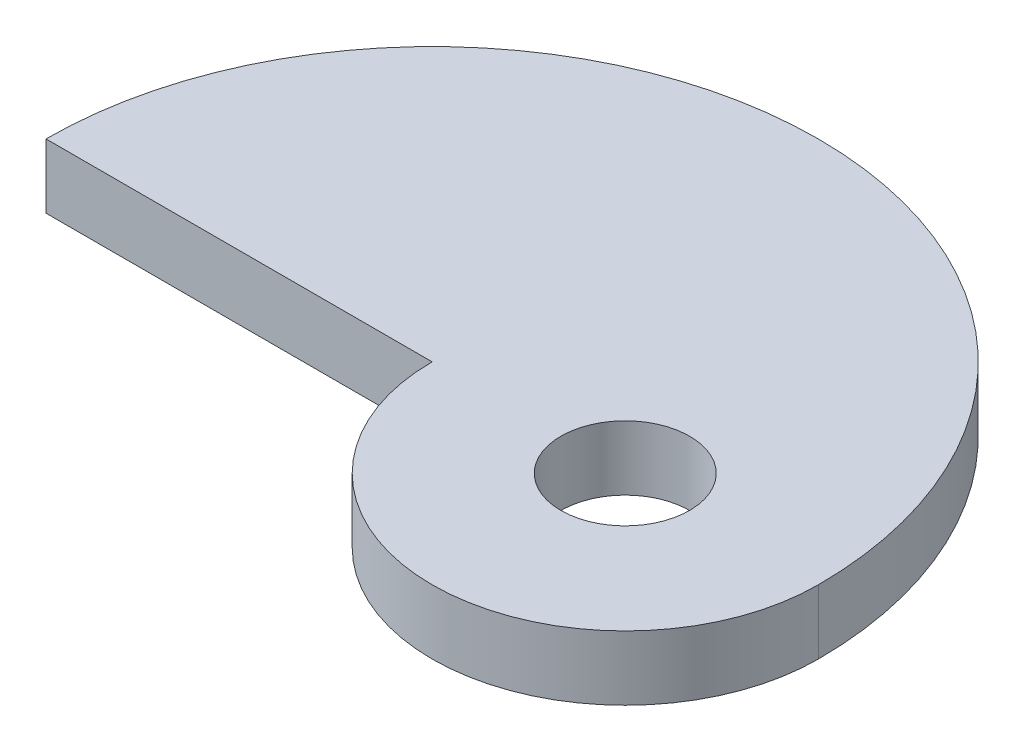
ISO-10303-21;
HEADER;
FILE_DESCRIPTION(('STEP AP214'),'2;1');
FILE_NAME('part.step','',(''),(''),'','','');
FILE_SCHEMA(('AUTOMOTIVE_DESIGN { 1 0 10303 214 1 1 1 1 }'));
ENDSEC;
DATA;
#1=APPLICATION_CONTEXT('core data for automotive mechanical design processes');
#2=APPLICATION_PROTOCOL_DEFINITION('international standard','automotive_design',2000,#1);
#3=PRODUCT_CONTEXT('',#1,'mechanical');
#4=PRODUCT('Part','Part','',(#3));
#5=PRODUCT_RELATED_PRODUCT_CATEGORY('part','',(#4));
#6=PRODUCT_DEFINITION_FORMATION('','',#4);
#7=PRODUCT_DEFINITION_CONTEXT('part definition',#1,'design');
#8=PRODUCT_DEFINITION('design','',#6,#7);
#9=PRODUCT_DEFINITION_SHAPE('','',#8);
#10=(LENGTH_UNIT() NAMED_UNIT(*) SI_UNIT(.MILLI.,.METRE.));
#11=(NAMED_UNIT(*) PLANE_ANGLE_UNIT() SI_UNIT($,.RADIAN.));
#12=(NAMED_UNIT(*) SI_UNIT($,.STERADIAN.) SOLID_ANGLE_UNIT());
#13=UNCERTAINTY_MEASURE_WITH_UNIT(LENGTH_MEASURE(1.E-05),#10,'distance_accuracy_value','');
#14=(GEOMETRIC_REPRESENTATION_CONTEXT(3) GLOBAL_UNCERTAINTY_ASSIGNED_CONTEXT((#13)) GLOBAL_UNIT_ASSIGNED_CONTEXT((#10,
#11,#12)) REPRESENTATION_CONTEXT('',''));
#15=CARTESIAN_POINT('',(0.,0.,0.));
#16=DIRECTION('',(0.,0.,1.));
#17=DIRECTION('',(1.,0.,0.));
#18=AXIS2_PLACEMENT_3D('',#15,#16,#17);
#19=CARTESIAN_POINT('',(0.,6.35,0.));
#20=DIRECTION('',(0.,0.,1.));
#21=DIRECTION('',(1.,0.,0.));
#22=AXIS2_PLACEMENT_3D('',#19,#20,#21);
#23=PLANE('',#22);
#24=DIRECTION('',(-1.,0.,0.));
#25=VECTOR('',#24,1.);
#26=CARTESIAN_POINT('',(0.,0.,0.));
#27=LINE('',#26,#25);
#28=CARTESIAN_POINT('',(0.,0.,0.));
#29=VERTEX_POINT('',#28);
#30=CARTESIAN_POINT('',(-38.1,0.,0.));
#31=VERTEX_POINT('',#30);
#32=EDGE_CURVE('E82',#29,#31,#27,.T.);
#33=ORIENTED_EDGE('',*,*,#32,.F.);
#34=DIRECTION('',(0.,-1.,0.));
#35=VECTOR('',#34,1.);
#36=CARTESIAN_POINT('',(0.,6.35,0.));
#37=LINE('',#36,#35);
#38=CARTESIAN_POINT('',(0.,6.35,0.));
#39=VERTEX_POINT('',#38);
#40=EDGE_CURVE('E11',#39,#29,#37,.T.);
#41=ORIENTED_EDGE('',*,*,#40,.F.);
#42=DIRECTION('',(-1.,0.,0.));
#43=VECTOR('',#42,1.);
#44=CARTESIAN_POINT('',(0.,6.35,0.));
#45=LINE('',#44,#43);
#46=CARTESIAN_POINT('',(-38.1,6.35,0.));
#47=VERTEX_POINT('',#46);
#48=EDGE_CURVE('E80',#39,#47,#45,.T.);
#49=ORIENTED_EDGE('',*,*,#48,.T.);
#50=DIRECTION('',(0.,-1.,0.));
#51=VECTOR('',#50,1.);
#52=CARTESIAN_POINT('',(-38.1,6.35,0.));
#53=LINE('',#52,#51);
#54=EDGE_CURVE('E76',#47,#31,#53,.T.);
#55=ORIENTED_EDGE('',*,*,#54,.T.);
#56=EDGE_LOOP('',(#33,#41,#49,#55));
#57=FACE_BOUND('',#56,.T.);
#58=ADVANCED_FACE('F41',(#57),#23,.T.);
#59=CARTESIAN_POINT('',(19.05,6.35,0.));
#60=DIRECTION('',(0.,-1.,0.));
#61=DIRECTION('',(0.,0.,-1.));
#62=AXIS2_PLACEMENT_3D('',#59,#60,#61);
#63=CYLINDRICAL_SURFACE('',#62,19.05);
#64=CARTESIAN_POINT('',(19.05,0.,0.));
#65=DIRECTION('',(0.,1.,0.));
#66=DIRECTION('',(0.,0.,1.));
#67=AXIS2_PLACEMENT_3D('',#64,#65,#66);
#68=CIRCLE('',#67,19.05);
#69=CARTESIAN_POINT('',(38.1,0.,0.));
#70=VERTEX_POINT('',#69);
#71=EDGE_CURVE('E70',#29,#70,#68,.T.);
#72=ORIENTED_EDGE('',*,*,#71,.T.);
#73=DIRECTION('',(0.,-1.,0.));
#74=VECTOR('',#73,1.);
#75=CARTESIAN_POINT('',(38.1,6.35,0.));
#76=LINE('',#75,#74);
#77=CARTESIAN_POINT('',(38.1,6.35,0.));
#78=VERTEX_POINT('',#77);
#79=EDGE_CURVE('E50',#78,#70,#76,.T.);
#80=ORIENTED_EDGE('',*,*,#79,.F.);
#81=CARTESIAN_POINT('',(19.05,6.35,0.));
#82=DIRECTION('',(0.,1.,0.));
#83=DIRECTION('',(0.,0.,1.));
#84=AXIS2_PLACEMENT_3D('',#81,#82,#83);
#85=CIRCLE('',#84,19.05);
#86=EDGE_CURVE('E83',#39,#78,#85,.T.);
#87=ORIENTED_EDGE('',*,*,#86,.F.);
#88=ORIENTED_EDGE('',*,*,#40,.T.);
#89=EDGE_LOOP('',(#72,#80,#87,#88));
#90=FACE_BOUND('',#89,.T.);
#91=ADVANCED_FACE('F84',(#90),#63,.T.);
#92=CARTESIAN_POINT('',(0.,6.35,0.));
#93=DIRECTION('',(0.,-1.,0.));
#94=DIRECTION('',(0.,0.,-1.));
#95=AXIS2_PLACEMENT_3D('',#92,#93,#94);
#96=CYLINDRICAL_SURFACE('',#95,38.1);
#97=CARTESIAN_POINT('',(0.,0.,0.));
#98=DIRECTION('',(0.,1.,0.));
#99=DIRECTION('',(0.,0.,1.));
#100=AXIS2_PLACEMENT_3D('',#97,#98,#99);
#101=CIRCLE('',#100,38.1);
#102=EDGE_CURVE('E89',#70,#31,#101,.T.);
#103=ORIENTED_EDGE('',*,*,#102,.T.);
#104=ORIENTED_EDGE('',*,*,#54,.F.);
#105=CARTESIAN_POINT('',(0.,6.35,0.));
#106=DIRECTION('',(0.,1.,0.));
#107=DIRECTION('',(0.,0.,1.));
#108=AXIS2_PLACEMENT_3D('',#105,#106,#107);
#109=CIRCLE('',#108,38.1);
#110=EDGE_CURVE('E58',#78,#47,#109,.T.);
#111=ORIENTED_EDGE('',*,*,#110,.F.);
#112=ORIENTED_EDGE('',*,*,#79,.T.);
#113=EDGE_LOOP('',(#103,#104,#111,#112));
#114=FACE_BOUND('',#113,.T.);
#115=ADVANCED_FACE('F108',(#114),#96,.T.);
#116=CARTESIAN_POINT('',(0.,6.35,0.));
#117=DIRECTION('',(0.,1.,0.));
#118=DIRECTION('',(0.,0.,1.));
#119=AXIS2_PLACEMENT_3D('',#116,#117,#118);
#120=PLANE('',#119);
#121=CARTESIAN_POINT('',(19.05,6.35,0.));
#122=DIRECTION('',(0.,1.,0.));
#123=DIRECTION('',(0.,0.,1.));
#124=AXIS2_PLACEMENT_3D('',#121,#122,#123);
#125=CIRCLE('',#124,6.35);
#126=CARTESIAN_POINT('',(19.05,6.35,6.35));
#127=VERTEX_POINT('',#126);
#128=EDGE_CURVE('E94',#127,#127,#125,.T.);
#129=ORIENTED_EDGE('',*,*,#128,.F.);
#130=EDGE_LOOP('',(#129));
#131=FACE_BOUND('',#130,.T.);
#132=ORIENTED_EDGE('',*,*,#48,.F.);
#133=ORIENTED_EDGE('',*,*,#86,.T.);
#134=ORIENTED_EDGE('',*,*,#110,.T.);
#135=EDGE_LOOP('',(#132,#133,#134));
#136=FACE_BOUND('',#135,.T.);
#137=ADVANCED_FACE('F87',(#131,#136),#120,.T.);
#138=CARTESIAN_POINT('',(0.,0.,0.));
#139=DIRECTION('',(0.,1.,0.));
#140=DIRECTION('',(0.,0.,1.));
#141=AXIS2_PLACEMENT_3D('',#138,#139,#140);
#142=PLANE('',#141);
#143=CARTESIAN_POINT('',(19.05,0.,0.));
#144=DIRECTION('',(0.,1.,0.));
#145=DIRECTION('',(0.,0.,1.));
#146=AXIS2_PLACEMENT_3D('',#143,#144,#145);
#147=CIRCLE('',#146,6.35);
#148=CARTESIAN_POINT('',(19.05,0.,6.35));
#149=VERTEX_POINT('',#148);
#150=EDGE_CURVE('E101',#149,#149,#147,.T.);
#151=ORIENTED_EDGE('',*,*,#150,.T.);
#152=EDGE_LOOP('',(#151));
#153=FACE_BOUND('',#152,.T.);
#154=ORIENTED_EDGE('',*,*,#32,.T.);
#155=ORIENTED_EDGE('',*,*,#102,.F.);
#156=ORIENTED_EDGE('',*,*,#71,.F.);
#157=EDGE_LOOP('',(#154,#155,#156));
#158=FACE_BOUND('',#157,.T.);
#159=ADVANCED_FACE('F110',(#153,#158),#142,.F.);
#160=CARTESIAN_POINT('',(19.05,0.,0.));
#161=DIRECTION('',(0.,1.,0.));
#162=DIRECTION('',(0.,0.,1.));
#163=AXIS2_PLACEMENT_3D('',#160,#161,#162);
#164=CYLINDRICAL_SURFACE('',#163,6.35);
#165=ORIENTED_EDGE('',*,*,#150,.F.);
#166=EDGE_LOOP('',(#165));
#167=FACE_BOUND('',#166,.T.);
#168=ORIENTED_EDGE('',*,*,#128,.T.);
#169=EDGE_LOOP('',(#168));
#170=FACE_BOUND('',#169,.T.);
#171=ADVANCED_FACE('F112',(#167,#170),#164,.F.);
#172=CLOSED_SHELL('',(#58,#91,#115,#137,#159,#171));
#173=MANIFOLD_SOLID_BREP('B2',#172);
#174=ADVANCED_BREP_SHAPE_REPRESENTATION('',(#18,#173),#14);
#175=SHAPE_DEFINITION_REPRESENTATION(#9,#174);
ENDSEC;
END-ISO-10303-21;
